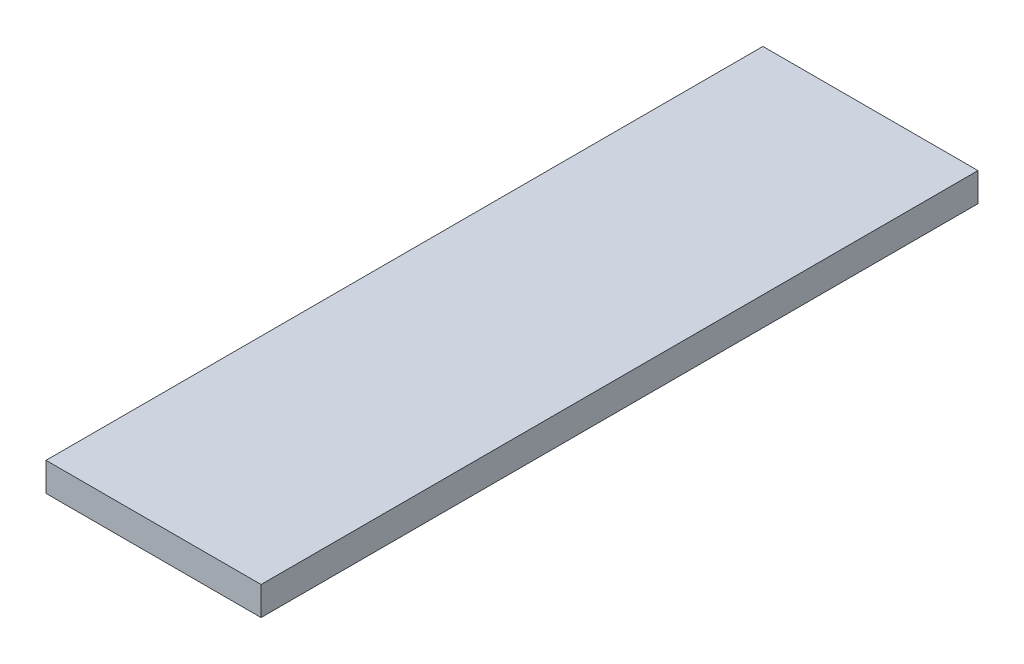
ISO-10303-21;
HEADER;
FILE_DESCRIPTION(('STEP AP214'),'2;1');
FILE_NAME('part.step','',(''),(''),'','','');
FILE_SCHEMA(('AUTOMOTIVE_DESIGN { 1 0 10303 214 1 1 1 1 }'));
ENDSEC;
DATA;
#1=APPLICATION_CONTEXT('core data for automotive mechanical design processes');
#2=APPLICATION_PROTOCOL_DEFINITION('international standard','automotive_design',2000,#1);
#3=PRODUCT_CONTEXT('',#1,'mechanical');
#4=PRODUCT('Part','Part','',(#3));
#5=PRODUCT_RELATED_PRODUCT_CATEGORY('part','',(#4));
#6=PRODUCT_DEFINITION_FORMATION('','',#4);
#7=PRODUCT_DEFINITION_CONTEXT('part definition',#1,'design');
#8=PRODUCT_DEFINITION('design','',#6,#7);
#9=PRODUCT_DEFINITION_SHAPE('','',#8);
#10=(LENGTH_UNIT() NAMED_UNIT(*) SI_UNIT(.MILLI.,.METRE.));
#11=(NAMED_UNIT(*) PLANE_ANGLE_UNIT() SI_UNIT($,.RADIAN.));
#12=(NAMED_UNIT(*) SI_UNIT($,.STERADIAN.) SOLID_ANGLE_UNIT());
#13=UNCERTAINTY_MEASURE_WITH_UNIT(LENGTH_MEASURE(1.E-05),#10,'distance_accuracy_value','');
#14=(GEOMETRIC_REPRESENTATION_CONTEXT(3) GLOBAL_UNCERTAINTY_ASSIGNED_CONTEXT((#13)) GLOBAL_UNIT_ASSIGNED_CONTEXT((#10,
#11,#12)) REPRESENTATION_CONTEXT('',''));
#15=CARTESIAN_POINT('',(0.,0.,0.));
#16=DIRECTION('',(0.,0.,1.));
#17=DIRECTION('',(1.,0.,0.));
#18=AXIS2_PLACEMENT_3D('',#15,#16,#17);
#19=CARTESIAN_POINT('',(0.,0.,500.));
#20=DIRECTION('',(1.,0.,0.));
#21=DIRECTION('',(0.,0.,-1.));
#22=AXIS2_PLACEMENT_3D('',#19,#20,#21);
#23=PLANE('',#22);
#24=DIRECTION('',(0.,-1.,0.));
#25=VECTOR('',#24,1.);
#26=CARTESIAN_POINT('',(0.,0.,0.));
#27=LINE('',#26,#25);
#28=CARTESIAN_POINT('',(0.,20.,0.));
#29=VERTEX_POINT('',#28);
#30=CARTESIAN_POINT('',(0.,0.,0.));
#31=VERTEX_POINT('',#30);
#32=EDGE_CURVE('E102',#29,#31,#27,.T.);
#33=ORIENTED_EDGE('',*,*,#32,.T.);
#34=DIRECTION('',(0.,0.,-1.));
#35=VECTOR('',#34,1.);
#36=CARTESIAN_POINT('',(0.,0.,500.));
#37=LINE('',#36,#35);
#38=CARTESIAN_POINT('',(0.,0.,500.));
#39=VERTEX_POINT('',#38);
#40=EDGE_CURVE('E11',#39,#31,#37,.T.);
#41=ORIENTED_EDGE('',*,*,#40,.F.);
#42=DIRECTION('',(0.,-1.,0.));
#43=VECTOR('',#42,1.);
#44=CARTESIAN_POINT('',(0.,0.,500.));
#45=LINE('',#44,#43);
#46=CARTESIAN_POINT('',(0.,20.,500.));
#47=VERTEX_POINT('',#46);
#48=EDGE_CURVE('E90',#47,#39,#45,.T.);
#49=ORIENTED_EDGE('',*,*,#48,.F.);
#50=DIRECTION('',(0.,0.,-1.));
#51=VECTOR('',#50,1.);
#52=CARTESIAN_POINT('',(0.,20.,500.));
#53=LINE('',#52,#51);
#54=EDGE_CURVE('E98',#47,#29,#53,.T.);
#55=ORIENTED_EDGE('',*,*,#54,.T.);
#56=EDGE_LOOP('',(#33,#41,#49,#55));
#57=FACE_BOUND('',#56,.T.);
#58=ADVANCED_FACE('F39',(#57),#23,.F.);
#59=CARTESIAN_POINT('',(0.,0.,500.));
#60=DIRECTION('',(0.,1.,0.));
#61=DIRECTION('',(0.,0.,1.));
#62=AXIS2_PLACEMENT_3D('',#59,#60,#61);
#63=PLANE('',#62);
#64=DIRECTION('',(1.,0.,0.));
#65=VECTOR('',#64,1.);
#66=CARTESIAN_POINT('',(0.,0.,0.));
#67=LINE('',#66,#65);
#68=CARTESIAN_POINT('',(150.,0.,0.));
#69=VERTEX_POINT('',#68);
#70=EDGE_CURVE('E94',#31,#69,#67,.T.);
#71=ORIENTED_EDGE('',*,*,#70,.T.);
#72=DIRECTION('',(0.,0.,-1.));
#73=VECTOR('',#72,1.);
#74=CARTESIAN_POINT('',(150.,0.,500.));
#75=LINE('',#74,#73);
#76=CARTESIAN_POINT('',(150.,0.,500.));
#77=VERTEX_POINT('',#76);
#78=EDGE_CURVE('E47',#77,#69,#75,.T.);
#79=ORIENTED_EDGE('',*,*,#78,.F.);
#80=DIRECTION('',(1.,0.,0.));
#81=VECTOR('',#80,1.);
#82=CARTESIAN_POINT('',(0.,0.,500.));
#83=LINE('',#82,#81);
#84=EDGE_CURVE('E85',#39,#77,#83,.T.);
#85=ORIENTED_EDGE('',*,*,#84,.F.);
#86=ORIENTED_EDGE('',*,*,#40,.T.);
#87=EDGE_LOOP('',(#71,#79,#85,#86));
#88=FACE_BOUND('',#87,.T.);
#89=ADVANCED_FACE('F93',(#88),#63,.F.);
#90=CARTESIAN_POINT('',(150.,0.,500.));
#91=DIRECTION('',(-1.,0.,0.));
#92=DIRECTION('',(0.,0.,1.));
#93=AXIS2_PLACEMENT_3D('',#90,#91,#92);
#94=PLANE('',#93);
#95=DIRECTION('',(0.,1.,0.));
#96=VECTOR('',#95,1.);
#97=CARTESIAN_POINT('',(150.,0.,0.));
#98=LINE('',#97,#96);
#99=CARTESIAN_POINT('',(150.,20.,0.));
#100=VERTEX_POINT('',#99);
#101=EDGE_CURVE('E72',#69,#100,#98,.T.);
#102=ORIENTED_EDGE('',*,*,#101,.T.);
#103=DIRECTION('',(0.,0.,-1.));
#104=VECTOR('',#103,1.);
#105=CARTESIAN_POINT('',(150.,20.,500.));
#106=LINE('',#105,#104);
#107=CARTESIAN_POINT('',(150.,20.,500.));
#108=VERTEX_POINT('',#107);
#109=EDGE_CURVE('E95',#108,#100,#106,.T.);
#110=ORIENTED_EDGE('',*,*,#109,.F.);
#111=DIRECTION('',(0.,1.,0.));
#112=VECTOR('',#111,1.);
#113=CARTESIAN_POINT('',(150.,0.,500.));
#114=LINE('',#113,#112);
#115=EDGE_CURVE('E88',#77,#108,#114,.T.);
#116=ORIENTED_EDGE('',*,*,#115,.F.);
#117=ORIENTED_EDGE('',*,*,#78,.T.);
#118=EDGE_LOOP('',(#102,#110,#116,#117));
#119=FACE_BOUND('',#118,.T.);
#120=ADVANCED_FACE('F96',(#119),#94,.F.);
#121=CARTESIAN_POINT('',(0.,20.,500.));
#122=DIRECTION('',(0.,-1.,0.));
#123=DIRECTION('',(0.,0.,-1.));
#124=AXIS2_PLACEMENT_3D('',#121,#122,#123);
#125=PLANE('',#124);
#126=DIRECTION('',(-1.,0.,0.));
#127=VECTOR('',#126,1.);
#128=CARTESIAN_POINT('',(0.,20.,0.));
#129=LINE('',#128,#127);
#130=EDGE_CURVE('E78',#100,#29,#129,.T.);
#131=ORIENTED_EDGE('',*,*,#130,.T.);
#132=ORIENTED_EDGE('',*,*,#54,.F.);
#133=DIRECTION('',(-1.,0.,0.));
#134=VECTOR('',#133,1.);
#135=CARTESIAN_POINT('',(0.,20.,500.));
#136=LINE('',#135,#134);
#137=EDGE_CURVE('E55',#108,#47,#136,.T.);
#138=ORIENTED_EDGE('',*,*,#137,.F.);
#139=ORIENTED_EDGE('',*,*,#109,.T.);
#140=EDGE_LOOP('',(#131,#132,#138,#139));
#141=FACE_BOUND('',#140,.T.);
#142=ADVANCED_FACE('F109',(#141),#125,.F.);
#143=CARTESIAN_POINT('',(0.,0.,500.));
#144=DIRECTION('',(0.,0.,-1.));
#145=DIRECTION('',(-1.,0.,0.));
#146=AXIS2_PLACEMENT_3D('',#143,#144,#145);
#147=PLANE('',#146);
#148=ORIENTED_EDGE('',*,*,#48,.T.);
#149=ORIENTED_EDGE('',*,*,#84,.T.);
#150=ORIENTED_EDGE('',*,*,#115,.T.);
#151=ORIENTED_EDGE('',*,*,#137,.T.);
#152=EDGE_LOOP('',(#148,#149,#150,#151));
#153=FACE_BOUND('',#152,.T.);
#154=ADVANCED_FACE('F86',(#153),#147,.F.);
#155=CARTESIAN_POINT('',(0.,0.,0.));
#156=DIRECTION('',(0.,0.,-1.));
#157=DIRECTION('',(-1.,0.,0.));
#158=AXIS2_PLACEMENT_3D('',#155,#156,#157);
#159=PLANE('',#158);
#160=ORIENTED_EDGE('',*,*,#32,.F.);
#161=ORIENTED_EDGE('',*,*,#130,.F.);
#162=ORIENTED_EDGE('',*,*,#101,.F.);
#163=ORIENTED_EDGE('',*,*,#70,.F.);
#164=EDGE_LOOP('',(#160,#161,#162,#163));
#165=FACE_BOUND('',#164,.T.);
#166=ADVANCED_FACE('F112',(#165),#159,.T.);
#167=CLOSED_SHELL('',(#58,#89,#120,#142,#154,#166));
#168=MANIFOLD_SOLID_BREP('B2',#167);
#169=ADVANCED_BREP_SHAPE_REPRESENTATION('',(#18,#168),#14);
#170=SHAPE_DEFINITION_REPRESENTATION(#9,#169);
ENDSEC;
END-ISO-10303-21;
